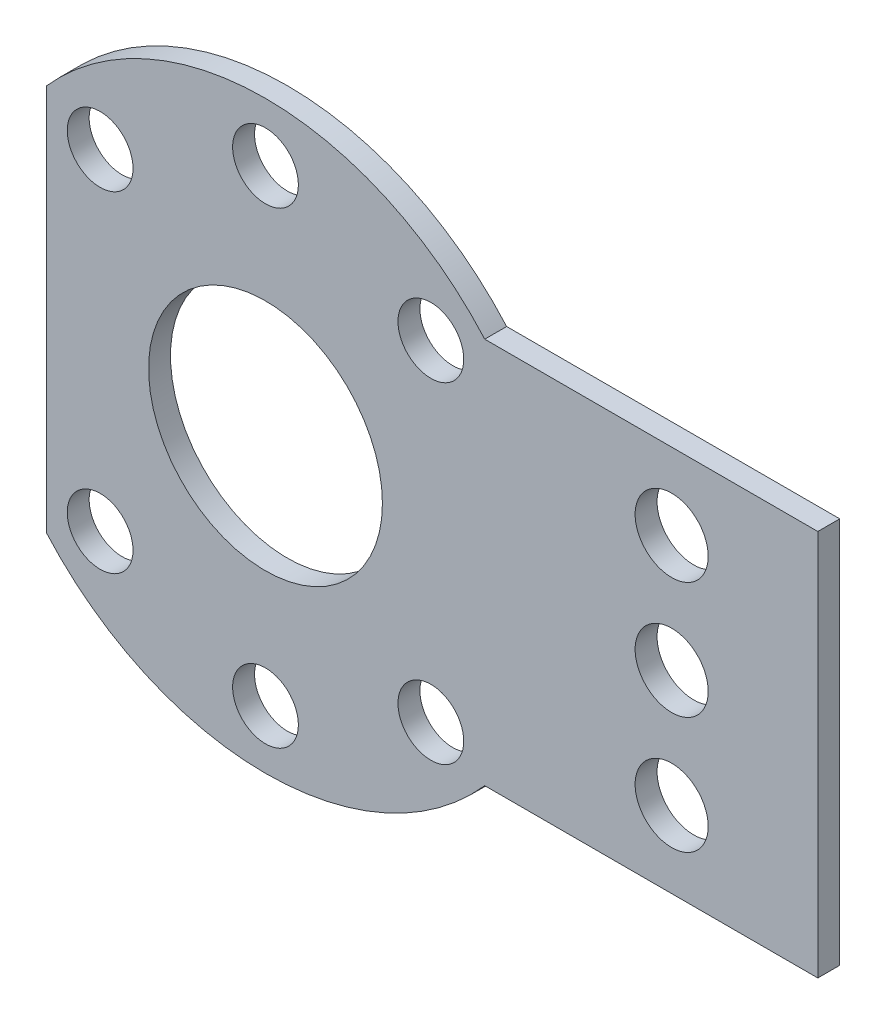
ISO-10303-21;
HEADER;
FILE_DESCRIPTION(('STEP AP214'),'2;1');
FILE_NAME('part.step','',(''),(''),'','','');
FILE_SCHEMA(('AUTOMOTIVE_DESIGN { 1 0 10303 214 1 1 1 1 }'));
ENDSEC;
DATA;
#1=APPLICATION_CONTEXT('core data for automotive mechanical design processes');
#2=APPLICATION_PROTOCOL_DEFINITION('international standard','automotive_design',2000,#1);
#3=PRODUCT_CONTEXT('',#1,'mechanical');
#4=PRODUCT('Part','Part','',(#3));
#5=PRODUCT_RELATED_PRODUCT_CATEGORY('part','',(#4));
#6=PRODUCT_DEFINITION_FORMATION('','',#4);
#7=PRODUCT_DEFINITION_CONTEXT('part definition',#1,'design');
#8=PRODUCT_DEFINITION('design','',#6,#7);
#9=PRODUCT_DEFINITION_SHAPE('','',#8);
#10=(LENGTH_UNIT() NAMED_UNIT(*) SI_UNIT(.MILLI.,.METRE.));
#11=(NAMED_UNIT(*) PLANE_ANGLE_UNIT() SI_UNIT($,.RADIAN.));
#12=(NAMED_UNIT(*) SI_UNIT($,.STERADIAN.) SOLID_ANGLE_UNIT());
#13=UNCERTAINTY_MEASURE_WITH_UNIT(LENGTH_MEASURE(1.E-05),#10,'distance_accuracy_value','');
#14=(GEOMETRIC_REPRESENTATION_CONTEXT(3) GLOBAL_UNCERTAINTY_ASSIGNED_CONTEXT((#13)) GLOBAL_UNIT_ASSIGNED_CONTEXT((#10,
#11,#12)) REPRESENTATION_CONTEXT('',''));
#15=CARTESIAN_POINT('',(0.,0.,0.));
#16=DIRECTION('',(0.,0.,1.));
#17=DIRECTION('',(1.,0.,0.));
#18=AXIS2_PLACEMENT_3D('',#15,#16,#17);
#19=CARTESIAN_POINT('',(0.,0.,1.5));
#20=DIRECTION('',(0.,0.,1.));
#21=DIRECTION('',(1.,0.,0.));
#22=AXIS2_PLACEMENT_3D('',#19,#20,#21);
#23=PLANE('',#22);
#24=CARTESIAN_POINT('',(27.79,8.,1.5));
#25=DIRECTION('',(0.,0.,1.));
#26=DIRECTION('',(1.,0.,0.));
#27=AXIS2_PLACEMENT_3D('',#24,#25,#26);
#28=CIRCLE('',#27,2.5);
#29=CARTESIAN_POINT('',(30.29,8.,1.5));
#30=VERTEX_POINT('',#29);
#31=EDGE_CURVE('E198',#30,#30,#28,.T.);
#32=ORIENTED_EDGE('',*,*,#31,.F.);
#33=EDGE_LOOP('',(#32));
#34=FACE_BOUND('',#33,.T.);
#35=CARTESIAN_POINT('',(11.3137084989848,-11.3137084989847,1.5));
#36=DIRECTION('',(0.,0.,1.));
#37=DIRECTION('',(1.,0.,0.));
#38=AXIS2_PLACEMENT_3D('',#35,#36,#37);
#39=CIRCLE('',#38,2.25);
#40=CARTESIAN_POINT('',(13.5637084989848,-11.3137084989847,1.5));
#41=VERTEX_POINT('',#40);
#42=EDGE_CURVE('E186',#41,#41,#39,.T.);
#43=ORIENTED_EDGE('',*,*,#42,.F.);
#44=EDGE_LOOP('',(#43));
#45=FACE_BOUND('',#44,.T.);
#46=CARTESIAN_POINT('',(-11.3137084989848,-11.3137084989847,1.5));
#47=DIRECTION('',(0.,0.,1.));
#48=DIRECTION('',(1.,0.,0.));
#49=AXIS2_PLACEMENT_3D('',#46,#47,#48);
#50=CIRCLE('',#49,2.25);
#51=CARTESIAN_POINT('',(-9.06370849898478,-11.3137084989847,1.5));
#52=VERTEX_POINT('',#51);
#53=EDGE_CURVE('E174',#52,#52,#50,.T.);
#54=ORIENTED_EDGE('',*,*,#53,.F.);
#55=EDGE_LOOP('',(#54));
#56=FACE_BOUND('',#55,.T.);
#57=CARTESIAN_POINT('',(0.,16.,1.5));
#58=DIRECTION('',(0.,0.,1.));
#59=DIRECTION('',(1.,0.,0.));
#60=AXIS2_PLACEMENT_3D('',#57,#58,#59);
#61=CIRCLE('',#60,2.25);
#62=CARTESIAN_POINT('',(2.24999999999999,16.,1.5));
#63=VERTEX_POINT('',#62);
#64=EDGE_CURVE('E162',#63,#63,#61,.T.);
#65=ORIENTED_EDGE('',*,*,#64,.F.);
#66=EDGE_LOOP('',(#65));
#67=FACE_BOUND('',#66,.T.);
#68=CARTESIAN_POINT('',(0.,0.,1.5));
#69=DIRECTION('',(0.,0.,1.));
#70=DIRECTION('',(1.,0.,0.));
#71=AXIS2_PLACEMENT_3D('',#68,#69,#70);
#72=CIRCLE('',#71,8.);
#73=CARTESIAN_POINT('',(8.,0.,1.5));
#74=VERTEX_POINT('',#73);
#75=EDGE_CURVE('E126',#74,#74,#72,.T.);
#76=ORIENTED_EDGE('',*,*,#75,.F.);
#77=EDGE_LOOP('',(#76));
#78=FACE_BOUND('',#77,.T.);
#79=DIRECTION('',(-1.,0.,0.));
#80=VECTOR('',#79,1.);
#81=CARTESIAN_POINT('',(17.79,13.228756555323,1.5));
#82=LINE('',#81,#80);
#83=CARTESIAN_POINT('',(37.79,13.228756555323,1.5));
#84=VERTEX_POINT('',#83);
#85=CARTESIAN_POINT('',(15.,13.228756555323,1.5));
#86=VERTEX_POINT('',#85);
#87=EDGE_CURVE('E91',#84,#86,#82,.T.);
#88=ORIENTED_EDGE('',*,*,#87,.T.);
#89=CARTESIAN_POINT('',(0.,0.,1.5));
#90=DIRECTION('',(0.,0.,1.));
#91=DIRECTION('',(1.,0.,0.));
#92=AXIS2_PLACEMENT_3D('',#89,#90,#91);
#93=CIRCLE('',#92,20.);
#94=CARTESIAN_POINT('',(-15.,13.2287565553229,1.5));
#95=VERTEX_POINT('',#94);
#96=EDGE_CURVE('E149',#86,#95,#93,.T.);
#97=ORIENTED_EDGE('',*,*,#96,.T.);
#98=DIRECTION('',(0.,-1.,0.));
#99=VECTOR('',#98,1.);
#100=CARTESIAN_POINT('',(-15.,13.2287565553229,1.5));
#101=LINE('',#100,#99);
#102=CARTESIAN_POINT('',(-15.,-13.2287565553229,1.5));
#103=VERTEX_POINT('',#102);
#104=EDGE_CURVE('E105',#95,#103,#101,.T.);
#105=ORIENTED_EDGE('',*,*,#104,.T.);
#106=CARTESIAN_POINT('',(0.,0.,1.5));
#107=DIRECTION('',(0.,0.,1.));
#108=DIRECTION('',(1.,0.,0.));
#109=AXIS2_PLACEMENT_3D('',#106,#107,#108);
#110=CIRCLE('',#109,20.);
#111=CARTESIAN_POINT('',(15.,-13.228756555323,1.5));
#112=VERTEX_POINT('',#111);
#113=EDGE_CURVE('E99',#103,#112,#110,.T.);
#114=ORIENTED_EDGE('',*,*,#113,.T.);
#115=DIRECTION('',(1.,0.,0.));
#116=VECTOR('',#115,1.);
#117=CARTESIAN_POINT('',(17.79,-13.2287565553229,1.5));
#118=LINE('',#117,#116);
#119=CARTESIAN_POINT('',(37.79,-13.2287565553229,1.5));
#120=VERTEX_POINT('',#119);
#121=EDGE_CURVE('E103',#112,#120,#118,.T.);
#122=ORIENTED_EDGE('',*,*,#121,.T.);
#123=DIRECTION('',(0.,1.,0.));
#124=VECTOR('',#123,1.);
#125=CARTESIAN_POINT('',(37.79,13.228756555323,1.5));
#126=LINE('',#125,#124);
#127=EDGE_CURVE('E56',#120,#84,#126,.T.);
#128=ORIENTED_EDGE('',*,*,#127,.T.);
#129=EDGE_LOOP('',(#88,#97,#105,#114,#122,#128));
#130=FACE_BOUND('',#129,.T.);
#131=CARTESIAN_POINT('',(-11.3137084989848,11.3137084989847,1.5));
#132=DIRECTION('',(0.,0.,1.));
#133=DIRECTION('',(1.,0.,0.));
#134=AXIS2_PLACEMENT_3D('',#131,#132,#133);
#135=CIRCLE('',#134,2.25);
#136=CARTESIAN_POINT('',(-9.06370849898478,11.3137084989847,1.5));
#137=VERTEX_POINT('',#136);
#138=EDGE_CURVE('E156',#137,#137,#135,.T.);
#139=ORIENTED_EDGE('',*,*,#138,.F.);
#140=EDGE_LOOP('',(#139));
#141=FACE_BOUND('',#140,.T.);
#142=CARTESIAN_POINT('',(11.3137084989848,11.3137084989847,1.5));
#143=DIRECTION('',(0.,0.,1.));
#144=DIRECTION('',(1.,0.,0.));
#145=AXIS2_PLACEMENT_3D('',#142,#143,#144);
#146=CIRCLE('',#145,2.25);
#147=CARTESIAN_POINT('',(13.5637084989848,11.3137084989847,1.5));
#148=VERTEX_POINT('',#147);
#149=EDGE_CURVE('E168',#148,#148,#146,.T.);
#150=ORIENTED_EDGE('',*,*,#149,.F.);
#151=EDGE_LOOP('',(#150));
#152=FACE_BOUND('',#151,.T.);
#153=CARTESIAN_POINT('',(0.,-16.,1.5));
#154=DIRECTION('',(0.,0.,1.));
#155=DIRECTION('',(1.,0.,0.));
#156=AXIS2_PLACEMENT_3D('',#153,#154,#155);
#157=CIRCLE('',#156,2.25);
#158=CARTESIAN_POINT('',(2.25,-16.,1.5));
#159=VERTEX_POINT('',#158);
#160=EDGE_CURVE('E180',#159,#159,#157,.T.);
#161=ORIENTED_EDGE('',*,*,#160,.F.);
#162=EDGE_LOOP('',(#161));
#163=FACE_BOUND('',#162,.T.);
#164=CARTESIAN_POINT('',(27.79,0.,1.5));
#165=DIRECTION('',(0.,0.,1.));
#166=DIRECTION('',(1.,0.,0.));
#167=AXIS2_PLACEMENT_3D('',#164,#165,#166);
#168=CIRCLE('',#167,2.5);
#169=CARTESIAN_POINT('',(30.29,0.,1.5));
#170=VERTEX_POINT('',#169);
#171=EDGE_CURVE('E192',#170,#170,#168,.T.);
#172=ORIENTED_EDGE('',*,*,#171,.F.);
#173=EDGE_LOOP('',(#172));
#174=FACE_BOUND('',#173,.T.);
#175=CARTESIAN_POINT('',(27.79,-7.99999999999999,1.5));
#176=DIRECTION('',(0.,0.,1.));
#177=DIRECTION('',(1.,0.,0.));
#178=AXIS2_PLACEMENT_3D('',#175,#176,#177);
#179=CIRCLE('',#178,2.5);
#180=CARTESIAN_POINT('',(30.29,-7.99999999999999,1.5));
#181=VERTEX_POINT('',#180);
#182=EDGE_CURVE('E204',#181,#181,#179,.T.);
#183=ORIENTED_EDGE('',*,*,#182,.F.);
#184=EDGE_LOOP('',(#183));
#185=FACE_BOUND('',#184,.T.);
#186=ADVANCED_FACE('F39',(#34,#45,#56,#67,#78,#130,#141,#152,#163,#174,#185),#23,.T.);
#187=CARTESIAN_POINT('',(0.,0.,0.));
#188=DIRECTION('',(0.,0.,1.));
#189=DIRECTION('',(1.,0.,0.));
#190=AXIS2_PLACEMENT_3D('',#187,#188,#189);
#191=PLANE('',#190);
#192=DIRECTION('',(-1.,0.,0.));
#193=VECTOR('',#192,1.);
#194=CARTESIAN_POINT('',(15.,13.228756555323,0.));
#195=LINE('',#194,#193);
#196=CARTESIAN_POINT('',(37.79,13.228756555323,0.));
#197=VERTEX_POINT('',#196);
#198=CARTESIAN_POINT('',(15.,13.228756555323,0.));
#199=VERTEX_POINT('',#198);
#200=EDGE_CURVE('E85',#197,#199,#195,.T.);
#201=ORIENTED_EDGE('',*,*,#200,.F.);
#202=DIRECTION('',(0.,1.,0.));
#203=VECTOR('',#202,1.);
#204=CARTESIAN_POINT('',(37.79,13.228756555323,0.));
#205=LINE('',#204,#203);
#206=CARTESIAN_POINT('',(37.79,-13.2287565553229,0.));
#207=VERTEX_POINT('',#206);
#208=EDGE_CURVE('E132',#207,#197,#205,.T.);
#209=ORIENTED_EDGE('',*,*,#208,.F.);
#210=DIRECTION('',(1.,0.,0.));
#211=VECTOR('',#210,1.);
#212=CARTESIAN_POINT('',(37.79,-13.2287565553229,0.));
#213=LINE('',#212,#211);
#214=CARTESIAN_POINT('',(15.,-13.228756555323,0.));
#215=VERTEX_POINT('',#214);
#216=EDGE_CURVE('E78',#215,#207,#213,.T.);
#217=ORIENTED_EDGE('',*,*,#216,.F.);
#218=CARTESIAN_POINT('',(0.,0.,0.));
#219=DIRECTION('',(0.,0.,1.));
#220=DIRECTION('',(1.,0.,0.));
#221=AXIS2_PLACEMENT_3D('',#218,#219,#220);
#222=CIRCLE('',#221,20.);
#223=CARTESIAN_POINT('',(-15.,-13.2287565553229,0.));
#224=VERTEX_POINT('',#223);
#225=EDGE_CURVE('E114',#224,#215,#222,.T.);
#226=ORIENTED_EDGE('',*,*,#225,.F.);
#227=DIRECTION('',(0.,-1.,0.));
#228=VECTOR('',#227,1.);
#229=CARTESIAN_POINT('',(-15.,13.2287565553229,0.));
#230=LINE('',#229,#228);
#231=CARTESIAN_POINT('',(-15.,13.2287565553229,0.));
#232=VERTEX_POINT('',#231);
#233=EDGE_CURVE('E128',#232,#224,#230,.T.);
#234=ORIENTED_EDGE('',*,*,#233,.F.);
#235=CARTESIAN_POINT('',(0.,0.,0.));
#236=DIRECTION('',(0.,0.,1.));
#237=DIRECTION('',(1.,0.,0.));
#238=AXIS2_PLACEMENT_3D('',#235,#236,#237);
#239=CIRCLE('',#238,20.);
#240=EDGE_CURVE('E125',#199,#232,#239,.T.);
#241=ORIENTED_EDGE('',*,*,#240,.F.);
#242=EDGE_LOOP('',(#201,#209,#217,#226,#234,#241));
#243=FACE_BOUND('',#242,.T.);
#244=CARTESIAN_POINT('',(0.,0.,0.));
#245=DIRECTION('',(0.,0.,1.));
#246=DIRECTION('',(1.,0.,0.));
#247=AXIS2_PLACEMENT_3D('',#244,#245,#246);
#248=CIRCLE('',#247,8.);
#249=CARTESIAN_POINT('',(8.,0.,0.));
#250=VERTEX_POINT('',#249);
#251=EDGE_CURVE('E153',#250,#250,#248,.T.);
#252=ORIENTED_EDGE('',*,*,#251,.T.);
#253=EDGE_LOOP('',(#252));
#254=FACE_BOUND('',#253,.T.);
#255=CARTESIAN_POINT('',(-11.3137084989848,11.3137084989847,0.));
#256=DIRECTION('',(0.,0.,1.));
#257=DIRECTION('',(1.,0.,0.));
#258=AXIS2_PLACEMENT_3D('',#255,#256,#257);
#259=CIRCLE('',#258,2.25);
#260=CARTESIAN_POINT('',(-9.06370849898478,11.3137084989847,0.));
#261=VERTEX_POINT('',#260);
#262=EDGE_CURVE('E159',#261,#261,#259,.T.);
#263=ORIENTED_EDGE('',*,*,#262,.T.);
#264=EDGE_LOOP('',(#263));
#265=FACE_BOUND('',#264,.T.);
#266=CARTESIAN_POINT('',(0.,16.,0.));
#267=DIRECTION('',(0.,0.,1.));
#268=DIRECTION('',(1.,0.,0.));
#269=AXIS2_PLACEMENT_3D('',#266,#267,#268);
#270=CIRCLE('',#269,2.25);
#271=CARTESIAN_POINT('',(2.24999999999999,16.,0.));
#272=VERTEX_POINT('',#271);
#273=EDGE_CURVE('E165',#272,#272,#270,.T.);
#274=ORIENTED_EDGE('',*,*,#273,.T.);
#275=EDGE_LOOP('',(#274));
#276=FACE_BOUND('',#275,.T.);
#277=CARTESIAN_POINT('',(11.3137084989848,11.3137084989847,0.));
#278=DIRECTION('',(0.,0.,1.));
#279=DIRECTION('',(1.,0.,0.));
#280=AXIS2_PLACEMENT_3D('',#277,#278,#279);
#281=CIRCLE('',#280,2.25);
#282=CARTESIAN_POINT('',(13.5637084989848,11.3137084989847,0.));
#283=VERTEX_POINT('',#282);
#284=EDGE_CURVE('E171',#283,#283,#281,.T.);
#285=ORIENTED_EDGE('',*,*,#284,.T.);
#286=EDGE_LOOP('',(#285));
#287=FACE_BOUND('',#286,.T.);
#288=CARTESIAN_POINT('',(-11.3137084989848,-11.3137084989847,0.));
#289=DIRECTION('',(0.,0.,1.));
#290=DIRECTION('',(1.,0.,0.));
#291=AXIS2_PLACEMENT_3D('',#288,#289,#290);
#292=CIRCLE('',#291,2.25);
#293=CARTESIAN_POINT('',(-9.06370849898478,-11.3137084989847,0.));
#294=VERTEX_POINT('',#293);
#295=EDGE_CURVE('E177',#294,#294,#292,.T.);
#296=ORIENTED_EDGE('',*,*,#295,.T.);
#297=EDGE_LOOP('',(#296));
#298=FACE_BOUND('',#297,.T.);
#299=CARTESIAN_POINT('',(0.,-16.,0.));
#300=DIRECTION('',(0.,0.,1.));
#301=DIRECTION('',(1.,0.,0.));
#302=AXIS2_PLACEMENT_3D('',#299,#300,#301);
#303=CIRCLE('',#302,2.25);
#304=CARTESIAN_POINT('',(2.25,-16.,0.));
#305=VERTEX_POINT('',#304);
#306=EDGE_CURVE('E183',#305,#305,#303,.T.);
#307=ORIENTED_EDGE('',*,*,#306,.T.);
#308=EDGE_LOOP('',(#307));
#309=FACE_BOUND('',#308,.T.);
#310=CARTESIAN_POINT('',(11.3137084989848,-11.3137084989847,0.));
#311=DIRECTION('',(0.,0.,1.));
#312=DIRECTION('',(1.,0.,0.));
#313=AXIS2_PLACEMENT_3D('',#310,#311,#312);
#314=CIRCLE('',#313,2.25);
#315=CARTESIAN_POINT('',(13.5637084989848,-11.3137084989847,0.));
#316=VERTEX_POINT('',#315);
#317=EDGE_CURVE('E189',#316,#316,#314,.T.);
#318=ORIENTED_EDGE('',*,*,#317,.T.);
#319=EDGE_LOOP('',(#318));
#320=FACE_BOUND('',#319,.T.);
#321=CARTESIAN_POINT('',(27.79,0.,0.));
#322=DIRECTION('',(0.,0.,1.));
#323=DIRECTION('',(1.,0.,0.));
#324=AXIS2_PLACEMENT_3D('',#321,#322,#323);
#325=CIRCLE('',#324,2.5);
#326=CARTESIAN_POINT('',(30.29,0.,0.));
#327=VERTEX_POINT('',#326);
#328=EDGE_CURVE('E195',#327,#327,#325,.T.);
#329=ORIENTED_EDGE('',*,*,#328,.T.);
#330=EDGE_LOOP('',(#329));
#331=FACE_BOUND('',#330,.T.);
#332=CARTESIAN_POINT('',(27.79,8.,0.));
#333=DIRECTION('',(0.,0.,1.));
#334=DIRECTION('',(1.,0.,0.));
#335=AXIS2_PLACEMENT_3D('',#332,#333,#334);
#336=CIRCLE('',#335,2.5);
#337=CARTESIAN_POINT('',(30.29,8.,0.));
#338=VERTEX_POINT('',#337);
#339=EDGE_CURVE('E201',#338,#338,#336,.T.);
#340=ORIENTED_EDGE('',*,*,#339,.T.);
#341=EDGE_LOOP('',(#340));
#342=FACE_BOUND('',#341,.T.);
#343=CARTESIAN_POINT('',(27.79,-7.99999999999999,0.));
#344=DIRECTION('',(0.,0.,1.));
#345=DIRECTION('',(1.,0.,0.));
#346=AXIS2_PLACEMENT_3D('',#343,#344,#345);
#347=CIRCLE('',#346,2.5);
#348=CARTESIAN_POINT('',(30.29,-7.99999999999999,0.));
#349=VERTEX_POINT('',#348);
#350=EDGE_CURVE('E207',#349,#349,#347,.T.);
#351=ORIENTED_EDGE('',*,*,#350,.T.);
#352=EDGE_LOOP('',(#351));
#353=FACE_BOUND('',#352,.T.);
#354=ADVANCED_FACE('F144',(#243,#254,#265,#276,#287,#298,#309,#320,#331,#342,#353),#191,.F.);
#355=CARTESIAN_POINT('',(15.,13.228756555323,1.5));
#356=DIRECTION('',(0.,-1.,0.));
#357=DIRECTION('',(0.,0.,-1.));
#358=AXIS2_PLACEMENT_3D('',#355,#356,#357);
#359=PLANE('',#358);
#360=ORIENTED_EDGE('',*,*,#200,.T.);
#361=DIRECTION('',(0.,0.,-1.));
#362=VECTOR('',#361,1.);
#363=CARTESIAN_POINT('',(15.,13.228756555323,1.5));
#364=LINE('',#363,#362);
#365=EDGE_CURVE('E11',#86,#199,#364,.T.);
#366=ORIENTED_EDGE('',*,*,#365,.F.);
#367=ORIENTED_EDGE('',*,*,#87,.F.);
#368=DIRECTION('',(0.,0.,-1.));
#369=VECTOR('',#368,1.);
#370=CARTESIAN_POINT('',(37.79,13.228756555323,1.5));
#371=LINE('',#370,#369);
#372=EDGE_CURVE('E120',#84,#197,#371,.T.);
#373=ORIENTED_EDGE('',*,*,#372,.T.);
#374=EDGE_LOOP('',(#360,#366,#367,#373));
#375=FACE_BOUND('',#374,.T.);
#376=ADVANCED_FACE('F41',(#375),#359,.F.);
#377=CARTESIAN_POINT('',(0.,0.,1.5));
#378=DIRECTION('',(0.,0.,-1.));
#379=DIRECTION('',(-1.,0.,0.));
#380=AXIS2_PLACEMENT_3D('',#377,#378,#379);
#381=CYLINDRICAL_SURFACE('',#380,20.);
#382=ORIENTED_EDGE('',*,*,#240,.T.);
#383=DIRECTION('',(0.,0.,-1.));
#384=VECTOR('',#383,1.);
#385=CARTESIAN_POINT('',(-15.,13.2287565553229,1.5));
#386=LINE('',#385,#384);
#387=EDGE_CURVE('E48',#95,#232,#386,.T.);
#388=ORIENTED_EDGE('',*,*,#387,.F.);
#389=ORIENTED_EDGE('',*,*,#96,.F.);
#390=ORIENTED_EDGE('',*,*,#365,.T.);
#391=EDGE_LOOP('',(#382,#388,#389,#390));
#392=FACE_BOUND('',#391,.T.);
#393=ADVANCED_FACE('F236',(#392),#381,.T.);
#394=CARTESIAN_POINT('',(-15.,13.2287565553229,1.5));
#395=DIRECTION('',(1.,0.,0.));
#396=DIRECTION('',(0.,1.,0.));
#397=AXIS2_PLACEMENT_3D('',#394,#395,#396);
#398=PLANE('',#397);
#399=ORIENTED_EDGE('',*,*,#233,.T.);
#400=DIRECTION('',(0.,0.,-1.));
#401=VECTOR('',#400,1.);
#402=CARTESIAN_POINT('',(-15.,-13.2287565553229,1.5));
#403=LINE('',#402,#401);
#404=EDGE_CURVE('E115',#103,#224,#403,.T.);
#405=ORIENTED_EDGE('',*,*,#404,.F.);
#406=ORIENTED_EDGE('',*,*,#104,.F.);
#407=ORIENTED_EDGE('',*,*,#387,.T.);
#408=EDGE_LOOP('',(#399,#405,#406,#407));
#409=FACE_BOUND('',#408,.T.);
#410=ADVANCED_FACE('F141',(#409),#398,.F.);
#411=CARTESIAN_POINT('',(0.,0.,1.5));
#412=DIRECTION('',(0.,0.,-1.));
#413=DIRECTION('',(-1.,0.,0.));
#414=AXIS2_PLACEMENT_3D('',#411,#412,#413);
#415=CYLINDRICAL_SURFACE('',#414,20.);
#416=ORIENTED_EDGE('',*,*,#225,.T.);
#417=DIRECTION('',(0.,0.,-1.));
#418=VECTOR('',#417,1.);
#419=CARTESIAN_POINT('',(15.,-13.228756555323,1.5));
#420=LINE('',#419,#418);
#421=EDGE_CURVE('E111',#112,#215,#420,.T.);
#422=ORIENTED_EDGE('',*,*,#421,.F.);
#423=ORIENTED_EDGE('',*,*,#113,.F.);
#424=ORIENTED_EDGE('',*,*,#404,.T.);
#425=EDGE_LOOP('',(#416,#422,#423,#424));
#426=FACE_BOUND('',#425,.T.);
#427=ADVANCED_FACE('F112',(#426),#415,.T.);
#428=CARTESIAN_POINT('',(37.79,-13.2287565553229,1.5));
#429=DIRECTION('',(0.,1.,0.));
#430=DIRECTION('',(-1.,0.,0.));
#431=AXIS2_PLACEMENT_3D('',#428,#429,#430);
#432=PLANE('',#431);
#433=ORIENTED_EDGE('',*,*,#216,.T.);
#434=DIRECTION('',(0.,0.,-1.));
#435=VECTOR('',#434,1.);
#436=CARTESIAN_POINT('',(37.79,-13.2287565553229,1.5));
#437=LINE('',#436,#435);
#438=EDGE_CURVE('E116',#120,#207,#437,.T.);
#439=ORIENTED_EDGE('',*,*,#438,.F.);
#440=ORIENTED_EDGE('',*,*,#121,.F.);
#441=ORIENTED_EDGE('',*,*,#421,.T.);
#442=EDGE_LOOP('',(#433,#439,#440,#441));
#443=FACE_BOUND('',#442,.T.);
#444=ADVANCED_FACE('F118',(#443),#432,.F.);
#445=CARTESIAN_POINT('',(37.79,13.228756555323,1.5));
#446=DIRECTION('',(-1.,0.,0.));
#447=DIRECTION('',(0.,-1.,0.));
#448=AXIS2_PLACEMENT_3D('',#445,#446,#447);
#449=PLANE('',#448);
#450=ORIENTED_EDGE('',*,*,#208,.T.);
#451=ORIENTED_EDGE('',*,*,#372,.F.);
#452=ORIENTED_EDGE('',*,*,#127,.F.);
#453=ORIENTED_EDGE('',*,*,#438,.T.);
#454=EDGE_LOOP('',(#450,#451,#452,#453));
#455=FACE_BOUND('',#454,.T.);
#456=ADVANCED_FACE('F147',(#455),#449,.F.);
#457=CARTESIAN_POINT('',(0.,0.,1.5));
#458=DIRECTION('',(0.,0.,-1.));
#459=DIRECTION('',(-1.,0.,0.));
#460=AXIS2_PLACEMENT_3D('',#457,#458,#459);
#461=CYLINDRICAL_SURFACE('',#460,8.);
#462=ORIENTED_EDGE('',*,*,#75,.T.);
#463=EDGE_LOOP('',(#462));
#464=FACE_BOUND('',#463,.T.);
#465=ORIENTED_EDGE('',*,*,#251,.F.);
#466=EDGE_LOOP('',(#465));
#467=FACE_BOUND('',#466,.T.);
#468=ADVANCED_FACE('F226',(#464,#467),#461,.F.);
#469=CARTESIAN_POINT('',(-11.3137084989848,11.3137084989847,1.5));
#470=DIRECTION('',(0.,0.,-1.));
#471=DIRECTION('',(-1.,0.,0.));
#472=AXIS2_PLACEMENT_3D('',#469,#470,#471);
#473=CYLINDRICAL_SURFACE('',#472,2.25);
#474=ORIENTED_EDGE('',*,*,#138,.T.);
#475=EDGE_LOOP('',(#474));
#476=FACE_BOUND('',#475,.T.);
#477=ORIENTED_EDGE('',*,*,#262,.F.);
#478=EDGE_LOOP('',(#477));
#479=FACE_BOUND('',#478,.T.);
#480=ADVANCED_FACE('F297',(#476,#479),#473,.F.);
#481=CARTESIAN_POINT('',(0.,16.,1.5));
#482=DIRECTION('',(0.,0.,-1.));
#483=DIRECTION('',(-1.,0.,0.));
#484=AXIS2_PLACEMENT_3D('',#481,#482,#483);
#485=CYLINDRICAL_SURFACE('',#484,2.25);
#486=ORIENTED_EDGE('',*,*,#64,.T.);
#487=EDGE_LOOP('',(#486));
#488=FACE_BOUND('',#487,.T.);
#489=ORIENTED_EDGE('',*,*,#273,.F.);
#490=EDGE_LOOP('',(#489));
#491=FACE_BOUND('',#490,.T.);
#492=ADVANCED_FACE('F305',(#488,#491),#485,.F.);
#493=CARTESIAN_POINT('',(11.3137084989848,11.3137084989847,1.5));
#494=DIRECTION('',(0.,0.,-1.));
#495=DIRECTION('',(-1.,0.,0.));
#496=AXIS2_PLACEMENT_3D('',#493,#494,#495);
#497=CYLINDRICAL_SURFACE('',#496,2.25);
#498=ORIENTED_EDGE('',*,*,#149,.T.);
#499=EDGE_LOOP('',(#498));
#500=FACE_BOUND('',#499,.T.);
#501=ORIENTED_EDGE('',*,*,#284,.F.);
#502=EDGE_LOOP('',(#501));
#503=FACE_BOUND('',#502,.T.);
#504=ADVANCED_FACE('F313',(#500,#503),#497,.F.);
#505=CARTESIAN_POINT('',(-11.3137084989848,-11.3137084989847,1.5));
#506=DIRECTION('',(0.,0.,-1.));
#507=DIRECTION('',(-1.,0.,0.));
#508=AXIS2_PLACEMENT_3D('',#505,#506,#507);
#509=CYLINDRICAL_SURFACE('',#508,2.25);
#510=ORIENTED_EDGE('',*,*,#53,.T.);
#511=EDGE_LOOP('',(#510));
#512=FACE_BOUND('',#511,.T.);
#513=ORIENTED_EDGE('',*,*,#295,.F.);
#514=EDGE_LOOP('',(#513));
#515=FACE_BOUND('',#514,.T.);
#516=ADVANCED_FACE('F322',(#512,#515),#509,.F.);
#517=CARTESIAN_POINT('',(0.,-16.,1.5));
#518=DIRECTION('',(0.,0.,-1.));
#519=DIRECTION('',(-1.,0.,0.));
#520=AXIS2_PLACEMENT_3D('',#517,#518,#519);
#521=CYLINDRICAL_SURFACE('',#520,2.25);
#522=ORIENTED_EDGE('',*,*,#160,.T.);
#523=EDGE_LOOP('',(#522));
#524=FACE_BOUND('',#523,.T.);
#525=ORIENTED_EDGE('',*,*,#306,.F.);
#526=EDGE_LOOP('',(#525));
#527=FACE_BOUND('',#526,.T.);
#528=ADVANCED_FACE('F331',(#524,#527),#521,.F.);
#529=CARTESIAN_POINT('',(11.3137084989848,-11.3137084989847,1.5));
#530=DIRECTION('',(0.,0.,-1.));
#531=DIRECTION('',(-1.,0.,0.));
#532=AXIS2_PLACEMENT_3D('',#529,#530,#531);
#533=CYLINDRICAL_SURFACE('',#532,2.25);
#534=ORIENTED_EDGE('',*,*,#42,.T.);
#535=EDGE_LOOP('',(#534));
#536=FACE_BOUND('',#535,.T.);
#537=ORIENTED_EDGE('',*,*,#317,.F.);
#538=EDGE_LOOP('',(#537));
#539=FACE_BOUND('',#538,.T.);
#540=ADVANCED_FACE('F340',(#536,#539),#533,.F.);
#541=CARTESIAN_POINT('',(27.79,0.,1.5));
#542=DIRECTION('',(0.,0.,-1.));
#543=DIRECTION('',(-1.,0.,0.));
#544=AXIS2_PLACEMENT_3D('',#541,#542,#543);
#545=CYLINDRICAL_SURFACE('',#544,2.5);
#546=ORIENTED_EDGE('',*,*,#171,.T.);
#547=EDGE_LOOP('',(#546));
#548=FACE_BOUND('',#547,.T.);
#549=ORIENTED_EDGE('',*,*,#328,.F.);
#550=EDGE_LOOP('',(#549));
#551=FACE_BOUND('',#550,.T.);
#552=ADVANCED_FACE('F349',(#548,#551),#545,.F.);
#553=CARTESIAN_POINT('',(27.79,8.,1.5));
#554=DIRECTION('',(0.,0.,-1.));
#555=DIRECTION('',(-1.,0.,0.));
#556=AXIS2_PLACEMENT_3D('',#553,#554,#555);
#557=CYLINDRICAL_SURFACE('',#556,2.5);
#558=ORIENTED_EDGE('',*,*,#31,.T.);
#559=EDGE_LOOP('',(#558));
#560=FACE_BOUND('',#559,.T.);
#561=ORIENTED_EDGE('',*,*,#339,.F.);
#562=EDGE_LOOP('',(#561));
#563=FACE_BOUND('',#562,.T.);
#564=ADVANCED_FACE('F358',(#560,#563),#557,.F.);
#565=CARTESIAN_POINT('',(27.79,-7.99999999999999,1.5));
#566=DIRECTION('',(0.,0.,-1.));
#567=DIRECTION('',(-1.,0.,0.));
#568=AXIS2_PLACEMENT_3D('',#565,#566,#567);
#569=CYLINDRICAL_SURFACE('',#568,2.5);
#570=ORIENTED_EDGE('',*,*,#182,.T.);
#571=EDGE_LOOP('',(#570));
#572=FACE_BOUND('',#571,.T.);
#573=ORIENTED_EDGE('',*,*,#350,.F.);
#574=EDGE_LOOP('',(#573));
#575=FACE_BOUND('',#574,.T.);
#576=ADVANCED_FACE('F213',(#572,#575),#569,.F.);
#577=CLOSED_SHELL('',(#186,#354,#376,#393,#410,#427,#444,#456,#468,#480,#492,#504,#516,#528,
#540,#552,#564,#576));
#578=MANIFOLD_SOLID_BREP('B2',#577);
#579=ADVANCED_BREP_SHAPE_REPRESENTATION('',(#18,#578),#14);
#580=SHAPE_DEFINITION_REPRESENTATION(#9,#579);
ENDSEC;
END-ISO-10303-21;
